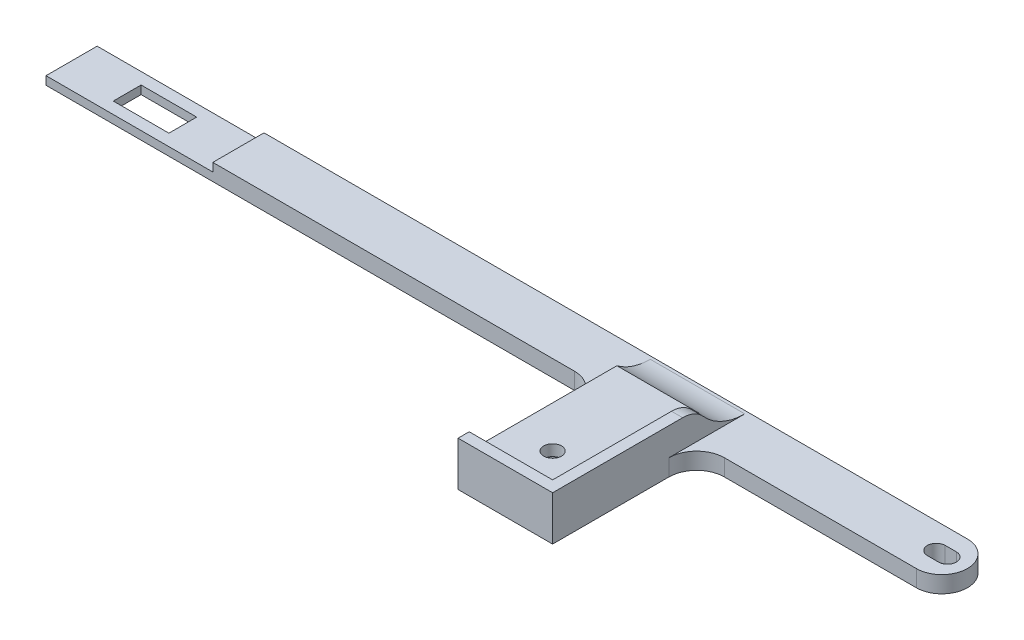
ISO-10303-21;
HEADER;
FILE_DESCRIPTION(('STEP AP214'),'2;1');
FILE_NAME('part.step','',(''),(''),'','','');
FILE_SCHEMA(('AUTOMOTIVE_DESIGN { 1 0 10303 214 1 1 1 1 }'));
ENDSEC;
DATA;
#1=APPLICATION_CONTEXT('core data for automotive mechanical design processes');
#2=APPLICATION_PROTOCOL_DEFINITION('international standard','automotive_design',2000,#1);
#3=PRODUCT_CONTEXT('',#1,'mechanical');
#4=PRODUCT('Part','Part','',(#3));
#5=PRODUCT_RELATED_PRODUCT_CATEGORY('part','',(#4));
#6=PRODUCT_DEFINITION_FORMATION('','',#4);
#7=PRODUCT_DEFINITION_CONTEXT('part definition',#1,'design');
#8=PRODUCT_DEFINITION('design','',#6,#7);
#9=PRODUCT_DEFINITION_SHAPE('','',#8);
#10=(LENGTH_UNIT() NAMED_UNIT(*) SI_UNIT(.MILLI.,.METRE.));
#11=(NAMED_UNIT(*) PLANE_ANGLE_UNIT() SI_UNIT($,.RADIAN.));
#12=(NAMED_UNIT(*) SI_UNIT($,.STERADIAN.) SOLID_ANGLE_UNIT());
#13=UNCERTAINTY_MEASURE_WITH_UNIT(LENGTH_MEASURE(1.E-05),#10,'distance_accuracy_value','');
#14=(GEOMETRIC_REPRESENTATION_CONTEXT(3) GLOBAL_UNCERTAINTY_ASSIGNED_CONTEXT((#13)) GLOBAL_UNIT_ASSIGNED_CONTEXT((#10,
#11,#12)) REPRESENTATION_CONTEXT('',''));
#15=CARTESIAN_POINT('',(0.,0.,0.));
#16=DIRECTION('',(0.,0.,1.));
#17=DIRECTION('',(1.,0.,0.));
#18=AXIS2_PLACEMENT_3D('',#15,#16,#17);
#19=CARTESIAN_POINT('',(0.,0.,0.));
#20=DIRECTION('',(1.,0.,0.));
#21=DIRECTION('',(0.,0.,-1.));
#22=AXIS2_PLACEMENT_3D('',#19,#20,#21);
#23=PLANE('',#22);
#24=DIRECTION('',(0.,0.,1.));
#25=VECTOR('',#24,1.);
#26=CARTESIAN_POINT('',(0.,1.5,-4.60000000000002));
#27=LINE('',#26,#25);
#28=CARTESIAN_POINT('',(0.,1.5,-4.60000000000002));
#29=VERTEX_POINT('',#28);
#30=CARTESIAN_POINT('',(0.,1.5,4.60000000000002));
#31=VERTEX_POINT('',#30);
#32=EDGE_CURVE('E277',#29,#31,#27,.T.);
#33=ORIENTED_EDGE('',*,*,#32,.F.);
#34=DIRECTION('',(0.,1.,0.));
#35=VECTOR('',#34,1.);
#36=CARTESIAN_POINT('',(0.,3.,-4.6));
#37=LINE('',#36,#35);
#38=CARTESIAN_POINT('',(0.,0.,-4.6));
#39=VERTEX_POINT('',#38);
#40=EDGE_CURVE('E487',#39,#29,#37,.T.);
#41=ORIENTED_EDGE('',*,*,#40,.F.);
#42=DIRECTION('',(0.,0.,-1.));
#43=VECTOR('',#42,1.);
#44=CARTESIAN_POINT('',(0.,0.,0.));
#45=LINE('',#44,#43);
#46=CARTESIAN_POINT('',(0.,0.,4.6));
#47=VERTEX_POINT('',#46);
#48=EDGE_CURVE('E40',#47,#39,#45,.T.);
#49=ORIENTED_EDGE('',*,*,#48,.F.);
#50=DIRECTION('',(0.,-1.,0.));
#51=VECTOR('',#50,1.);
#52=CARTESIAN_POINT('',(0.,3.,4.6));
#53=LINE('',#52,#51);
#54=EDGE_CURVE('E11',#31,#47,#53,.T.);
#55=ORIENTED_EDGE('',*,*,#54,.F.);
#56=EDGE_LOOP('',(#33,#41,#49,#55));
#57=FACE_BOUND('',#56,.T.);
#58=ADVANCED_FACE('F33',(#57),#23,.F.);
#59=CARTESIAN_POINT('',(107.5,9.52548339959392,21.));
#60=DIRECTION('',(0.,-1.,0.));
#61=DIRECTION('',(0.,0.,-1.));
#62=AXIS2_PLACEMENT_3D('',#59,#60,#61);
#63=CYLINDRICAL_SURFACE('',#62,1.6);
#64=CARTESIAN_POINT('',(107.5,5.,21.));
#65=DIRECTION('',(0.,-1.,0.));
#66=DIRECTION('',(0.,0.,-1.));
#67=AXIS2_PLACEMENT_3D('',#64,#65,#66);
#68=CIRCLE('',#67,1.6);
#69=CARTESIAN_POINT('',(107.5,5.,19.4));
#70=VERTEX_POINT('',#69);
#71=EDGE_CURVE('E295',#70,#70,#68,.F.);
#72=ORIENTED_EDGE('',*,*,#71,.T.);
#73=EDGE_LOOP('',(#72));
#74=FACE_BOUND('',#73,.T.);
#75=CARTESIAN_POINT('',(107.5,3.,21.));
#76=DIRECTION('',(0.,-1.,0.));
#77=DIRECTION('',(0.,0.,1.));
#78=AXIS2_PLACEMENT_3D('',#75,#76,#77);
#79=CIRCLE('',#78,1.6);
#80=CARTESIAN_POINT('',(107.5,3.,22.6));
#81=VERTEX_POINT('',#80);
#82=EDGE_CURVE('E291',#81,#81,#79,.T.);
#83=ORIENTED_EDGE('',*,*,#82,.T.);
#84=EDGE_LOOP('',(#83));
#85=FACE_BOUND('',#84,.T.);
#86=ADVANCED_FACE('F558',(#74,#85),#63,.F.);
#87=CARTESIAN_POINT('',(115.,8.,4.6));
#88=DIRECTION('',(1.,0.,0.));
#89=DIRECTION('',(0.,0.,-1.));
#90=AXIS2_PLACEMENT_3D('',#87,#88,#89);
#91=PLANE('',#90);
#92=DIRECTION('',(0.,0.,1.));
#93=VECTOR('',#92,1.);
#94=CARTESIAN_POINT('',(115.,8.,4.6));
#95=LINE('',#94,#93);
#96=CARTESIAN_POINT('',(115.,8.,7.12008584965456));
#97=VERTEX_POINT('',#96);
#98=CARTESIAN_POINT('',(115.,8.,28.5));
#99=VERTEX_POINT('',#98);
#100=EDGE_CURVE('E354',#97,#99,#95,.T.);
#101=ORIENTED_EDGE('',*,*,#100,.F.);
#102=CARTESIAN_POINT('',(115.,3.,7.12008584965456));
#103=DIRECTION('',(1.,0.,0.));
#104=DIRECTION('',(0.,0.,-1.));
#105=AXIS2_PLACEMENT_3D('',#102,#103,#104);
#106=CIRCLE('',#105,5.);
#107=CARTESIAN_POINT('',(115.,6.33333333333333,3.39330588715491));
#108=VERTEX_POINT('',#107);
#109=EDGE_CURVE('E481',#97,#108,#106,.F.);
#110=ORIENTED_EDGE('',*,*,#109,.T.);
#111=CARTESIAN_POINT('',(115.,13.,-4.06025403784438));
#112=DIRECTION('',(1.,0.,0.));
#113=DIRECTION('',(0.,0.,-1.));
#114=AXIS2_PLACEMENT_3D('',#111,#112,#113);
#115=CIRCLE('',#114,10.);
#116=CARTESIAN_POINT('',(115.,5.,1.93974596215562));
#117=VERTEX_POINT('',#116);
#118=EDGE_CURVE('E450',#108,#117,#115,.T.);
#119=ORIENTED_EDGE('',*,*,#118,.T.);
#120=DIRECTION('',(0.,0.,1.));
#121=VECTOR('',#120,1.);
#122=CARTESIAN_POINT('',(115.,5.,4.6));
#123=LINE('',#122,#121);
#124=CARTESIAN_POINT('',(115.,5.,28.5));
#125=VERTEX_POINT('',#124);
#126=EDGE_CURVE('E336',#117,#125,#123,.T.);
#127=ORIENTED_EDGE('',*,*,#126,.T.);
#128=DIRECTION('',(0.,-1.,0.));
#129=VECTOR('',#128,1.);
#130=CARTESIAN_POINT('',(115.,8.,28.5));
#131=LINE('',#130,#129);
#132=EDGE_CURVE('E368',#99,#125,#131,.T.);
#133=ORIENTED_EDGE('',*,*,#132,.F.);
#134=EDGE_LOOP('',(#101,#110,#119,#127,#133));
#135=FACE_BOUND('',#134,.T.);
#136=ADVANCED_FACE('F562',(#135),#91,.F.);
#137=CARTESIAN_POINT('',(0.,5.,0.));
#138=DIRECTION('',(0.,1.,0.));
#139=DIRECTION('',(0.,0.,1.));
#140=AXIS2_PLACEMENT_3D('',#137,#138,#139);
#141=PLANE('',#140);
#142=ORIENTED_EDGE('',*,*,#71,.F.);
#143=EDGE_LOOP('',(#142));
#144=FACE_BOUND('',#143,.T.);
#145=DIRECTION('',(-1.,0.,0.));
#146=VECTOR('',#145,1.);
#147=CARTESIAN_POINT('',(115.,5.,28.5));
#148=LINE('',#147,#146);
#149=CARTESIAN_POINT('',(100.,5.,28.5));
#150=VERTEX_POINT('',#149);
#151=EDGE_CURVE('E351',#125,#150,#148,.T.);
#152=ORIENTED_EDGE('',*,*,#151,.F.);
#153=ORIENTED_EDGE('',*,*,#126,.F.);
#154=DIRECTION('',(1.,0.,0.));
#155=VECTOR('',#154,1.);
#156=CARTESIAN_POINT('',(115.,5.,1.93974596215561));
#157=LINE('',#156,#155);
#158=CARTESIAN_POINT('',(100.,5.,1.93974596215562));
#159=VERTEX_POINT('',#158);
#160=EDGE_CURVE('E452',#117,#159,#157,.F.);
#161=ORIENTED_EDGE('',*,*,#160,.T.);
#162=DIRECTION('',(0.,0.,1.));
#163=VECTOR('',#162,1.);
#164=CARTESIAN_POINT('',(100.,5.,4.6));
#165=LINE('',#164,#163);
#166=EDGE_CURVE('E379',#159,#150,#165,.T.);
#167=ORIENTED_EDGE('',*,*,#166,.T.);
#168=EDGE_LOOP('',(#152,#153,#161,#167));
#169=FACE_BOUND('',#168,.T.);
#170=ADVANCED_FACE('F601',(#144,#169),#141,.T.);
#171=CARTESIAN_POINT('',(115.,8.,28.5));
#172=DIRECTION('',(0.,0.,1.));
#173=DIRECTION('',(1.,0.,0.));
#174=AXIS2_PLACEMENT_3D('',#171,#172,#173);
#175=PLANE('',#174);
#176=ORIENTED_EDGE('',*,*,#151,.T.);
#177=DIRECTION('',(0.,-1.,0.));
#178=VECTOR('',#177,1.);
#179=CARTESIAN_POINT('',(100.,8.,28.5));
#180=LINE('',#179,#178);
#181=CARTESIAN_POINT('',(100.,8.,28.5));
#182=VERTEX_POINT('',#181);
#183=EDGE_CURVE('E361',#182,#150,#180,.T.);
#184=ORIENTED_EDGE('',*,*,#183,.F.);
#185=DIRECTION('',(-1.,0.,0.));
#186=VECTOR('',#185,1.);
#187=CARTESIAN_POINT('',(115.,8.,28.5));
#188=LINE('',#187,#186);
#189=EDGE_CURVE('E356',#99,#182,#188,.T.);
#190=ORIENTED_EDGE('',*,*,#189,.F.);
#191=ORIENTED_EDGE('',*,*,#132,.T.);
#192=EDGE_LOOP('',(#176,#184,#190,#191));
#193=FACE_BOUND('',#192,.T.);
#194=ADVANCED_FACE('F597',(#193),#175,.F.);
#195=CARTESIAN_POINT('',(0.,8.,0.));
#196=DIRECTION('',(0.,-1.,0.));
#197=DIRECTION('',(0.,0.,-1.));
#198=AXIS2_PLACEMENT_3D('',#195,#196,#197);
#199=PLANE('',#198);
#200=DIRECTION('',(0.,0.,-1.));
#201=VECTOR('',#200,1.);
#202=CARTESIAN_POINT('',(117.,8.,4.6));
#203=LINE('',#202,#201);
#204=CARTESIAN_POINT('',(117.,8.,30.5));
#205=VERTEX_POINT('',#204);
#206=CARTESIAN_POINT('',(117.,8.,7.12008584965456));
#207=VERTEX_POINT('',#206);
#208=EDGE_CURVE('E350',#205,#207,#203,.T.);
#209=ORIENTED_EDGE('',*,*,#208,.T.);
#210=DIRECTION('',(1.,0.,0.));
#211=VECTOR('',#210,1.);
#212=CARTESIAN_POINT('',(0.,8.,7.12008584965456));
#213=LINE('',#212,#211);
#214=EDGE_CURVE('E478',#207,#97,#213,.F.);
#215=ORIENTED_EDGE('',*,*,#214,.T.);
#216=ORIENTED_EDGE('',*,*,#100,.T.);
#217=ORIENTED_EDGE('',*,*,#189,.T.);
#218=DIRECTION('',(0.,0.,1.));
#219=VECTOR('',#218,1.);
#220=CARTESIAN_POINT('',(100.,8.,30.5));
#221=LINE('',#220,#219);
#222=CARTESIAN_POINT('',(100.,8.,30.5));
#223=VERTEX_POINT('',#222);
#224=EDGE_CURVE('E358',#182,#223,#221,.T.);
#225=ORIENTED_EDGE('',*,*,#224,.T.);
#226=DIRECTION('',(1.,0.,0.));
#227=VECTOR('',#226,1.);
#228=CARTESIAN_POINT('',(117.,8.,30.5));
#229=LINE('',#228,#227);
#230=EDGE_CURVE('E347',#223,#205,#229,.T.);
#231=ORIENTED_EDGE('',*,*,#230,.T.);
#232=EDGE_LOOP('',(#209,#215,#216,#217,#225,#231));
#233=FACE_BOUND('',#232,.T.);
#234=ADVANCED_FACE('F593',(#233),#199,.F.);
#235=CARTESIAN_POINT('',(117.,3.,7.12008584965456));
#236=DIRECTION('',(1.,0.,0.));
#237=DIRECTION('',(0.,0.,-1.));
#238=AXIS2_PLACEMENT_3D('',#235,#236,#237);
#239=CYLINDRICAL_SURFACE('',#238,5.);
#240=CARTESIAN_POINT('',(117.,3.,7.12008584965456));
#241=DIRECTION('',(-1.,0.,0.));
#242=DIRECTION('',(0.,0.,1.));
#243=AXIS2_PLACEMENT_3D('',#240,#241,#242);
#244=CIRCLE('',#243,5.);
#245=CARTESIAN_POINT('',(117.,6.33333333333333,3.39330588715491));
#246=VERTEX_POINT('',#245);
#247=EDGE_CURVE('E485',#246,#207,#244,.F.);
#248=ORIENTED_EDGE('',*,*,#247,.F.);
#249=DIRECTION('',(1.,0.,0.));
#250=VECTOR('',#249,1.);
#251=CARTESIAN_POINT('',(117.,6.33333333333333,3.39330588715491));
#252=LINE('',#251,#250);
#253=EDGE_CURVE('E483',#108,#246,#252,.T.);
#254=ORIENTED_EDGE('',*,*,#253,.F.);
#255=ORIENTED_EDGE('',*,*,#109,.F.);
#256=ORIENTED_EDGE('',*,*,#214,.F.);
#257=EDGE_LOOP('',(#248,#254,#255,#256));
#258=FACE_BOUND('',#257,.T.);
#259=ADVANCED_FACE('F596',(#258),#239,.T.);
#260=CARTESIAN_POINT('',(0.,3.,0.));
#261=DIRECTION('',(0.,1.,0.));
#262=DIRECTION('',(0.,0.,1.));
#263=AXIS2_PLACEMENT_3D('',#260,#261,#262);
#264=PLANE('',#263);
#265=ORIENTED_EDGE('',*,*,#82,.F.);
#266=EDGE_LOOP('',(#265));
#267=FACE_BOUND('',#266,.T.);
#268=DIRECTION('',(0.866025403784439,0.,0.5));
#269=VECTOR('',#268,1.);
#270=CARTESIAN_POINT('',(110.3,3.,19.383419246269));
#271=LINE('',#270,#269);
#272=CARTESIAN_POINT('',(107.5,3.,17.7668384925381));
#273=VERTEX_POINT('',#272);
#274=CARTESIAN_POINT('',(110.3,3.,19.383419246269));
#275=VERTEX_POINT('',#274);
#276=EDGE_CURVE('E299',#273,#275,#271,.T.);
#277=ORIENTED_EDGE('',*,*,#276,.T.);
#278=DIRECTION('',(0.,0.,1.));
#279=VECTOR('',#278,1.);
#280=CARTESIAN_POINT('',(110.3,3.,22.616580753731));
#281=LINE('',#280,#279);
#282=CARTESIAN_POINT('',(110.3,3.,22.616580753731));
#283=VERTEX_POINT('',#282);
#284=EDGE_CURVE('E302',#275,#283,#281,.T.);
#285=ORIENTED_EDGE('',*,*,#284,.T.);
#286=DIRECTION('',(-0.866025403784438,0.,0.500000000000001));
#287=VECTOR('',#286,1.);
#288=CARTESIAN_POINT('',(107.5,3.,24.2331615074619));
#289=LINE('',#288,#287);
#290=CARTESIAN_POINT('',(107.5,3.,24.2331615074619));
#291=VERTEX_POINT('',#290);
#292=EDGE_CURVE('E306',#283,#291,#289,.T.);
#293=ORIENTED_EDGE('',*,*,#292,.T.);
#294=DIRECTION('',(-0.866025403784439,0.,-0.499999999999999));
#295=VECTOR('',#294,1.);
#296=CARTESIAN_POINT('',(104.7,3.,22.6165807537309));
#297=LINE('',#296,#295);
#298=CARTESIAN_POINT('',(104.7,3.,22.6165807537309));
#299=VERTEX_POINT('',#298);
#300=EDGE_CURVE('E309',#291,#299,#297,.T.);
#301=ORIENTED_EDGE('',*,*,#300,.T.);
#302=DIRECTION('',(0.,0.,-1.));
#303=VECTOR('',#302,1.);
#304=CARTESIAN_POINT('',(104.7,3.,19.383419246269));
#305=LINE('',#304,#303);
#306=CARTESIAN_POINT('',(104.7,3.,19.383419246269));
#307=VERTEX_POINT('',#306);
#308=EDGE_CURVE('E312',#299,#307,#305,.T.);
#309=ORIENTED_EDGE('',*,*,#308,.T.);
#310=DIRECTION('',(0.866025403784438,0.,-0.500000000000001));
#311=VECTOR('',#310,1.);
#312=CARTESIAN_POINT('',(107.5,3.,17.7668384925381));
#313=LINE('',#312,#311);
#314=EDGE_CURVE('E315',#307,#273,#313,.T.);
#315=ORIENTED_EDGE('',*,*,#314,.T.);
#316=EDGE_LOOP('',(#277,#285,#293,#301,#309,#315));
#317=FACE_BOUND('',#316,.T.);
#318=ADVANCED_FACE('F648',(#267,#317),#264,.F.);
#319=CARTESIAN_POINT('',(117.,13.,-4.06025403784438));
#320=DIRECTION('',(1.,0.,0.));
#321=DIRECTION('',(0.,0.,-1.));
#322=AXIS2_PLACEMENT_3D('',#319,#320,#321);
#323=CYLINDRICAL_SURFACE('',#322,10.);
#324=ORIENTED_EDGE('',*,*,#118,.F.);
#325=ORIENTED_EDGE('',*,*,#253,.T.);
#326=CARTESIAN_POINT('',(117.,13.,-4.06025403784438));
#327=DIRECTION('',(-1.,0.,0.));
#328=DIRECTION('',(0.,0.,1.));
#329=AXIS2_PLACEMENT_3D('',#326,#327,#328);
#330=CIRCLE('',#329,10.);
#331=CARTESIAN_POINT('',(117.,3.,-4.06025403784438));
#332=VERTEX_POINT('',#331);
#333=EDGE_CURVE('E447',#332,#246,#330,.T.);
#334=ORIENTED_EDGE('',*,*,#333,.F.);
#335=DIRECTION('',(-1.,0.,0.));
#336=VECTOR('',#335,1.);
#337=CARTESIAN_POINT('',(117.,3.,-4.06025403784438));
#338=LINE('',#337,#336);
#339=CARTESIAN_POINT('',(100.,3.,-4.06025403784438));
#340=VERTEX_POINT('',#339);
#341=EDGE_CURVE('E442',#340,#332,#338,.F.);
#342=ORIENTED_EDGE('',*,*,#341,.F.);
#343=CARTESIAN_POINT('',(100.,13.,-4.06025403784438));
#344=DIRECTION('',(1.,0.,0.));
#345=DIRECTION('',(0.,0.,-1.));
#346=AXIS2_PLACEMENT_3D('',#343,#344,#345);
#347=CIRCLE('',#346,10.);
#348=EDGE_CURVE('E455',#159,#340,#347,.T.);
#349=ORIENTED_EDGE('',*,*,#348,.F.);
#350=ORIENTED_EDGE('',*,*,#160,.F.);
#351=EDGE_LOOP('',(#324,#325,#334,#342,#349,#350));
#352=FACE_BOUND('',#351,.T.);
#353=ADVANCED_FACE('F620',(#352),#323,.F.);
#354=CARTESIAN_POINT('',(155.5,3.,-1.60000000000004));
#355=DIRECTION('',(0.,0.,1.));
#356=DIRECTION('',(1.,0.,0.));
#357=AXIS2_PLACEMENT_3D('',#354,#355,#356);
#358=PLANE('',#357);
#359=DIRECTION('',(-1.,0.,0.));
#360=VECTOR('',#359,1.);
#361=CARTESIAN_POINT('',(155.5,0.,-1.60000000000004));
#362=LINE('',#361,#360);
#363=CARTESIAN_POINT('',(157.5,0.,-1.60000000000004));
#364=VERTEX_POINT('',#363);
#365=CARTESIAN_POINT('',(155.5,0.,-1.60000000000004));
#366=VERTEX_POINT('',#365);
#367=EDGE_CURVE('E390',#364,#366,#362,.T.);
#368=ORIENTED_EDGE('',*,*,#367,.F.);
#369=DIRECTION('',(0.,-1.,0.));
#370=VECTOR('',#369,1.);
#371=CARTESIAN_POINT('',(157.5,3.,-1.60000000000004));
#372=LINE('',#371,#370);
#373=CARTESIAN_POINT('',(157.5,3.,-1.60000000000004));
#374=VERTEX_POINT('',#373);
#375=EDGE_CURVE('E410',#374,#364,#372,.T.);
#376=ORIENTED_EDGE('',*,*,#375,.F.);
#377=DIRECTION('',(-1.,0.,0.));
#378=VECTOR('',#377,1.);
#379=CARTESIAN_POINT('',(155.5,3.,-1.60000000000004));
#380=LINE('',#379,#378);
#381=CARTESIAN_POINT('',(155.5,3.,-1.60000000000004));
#382=VERTEX_POINT('',#381);
#383=EDGE_CURVE('E395',#374,#382,#380,.T.);
#384=ORIENTED_EDGE('',*,*,#383,.T.);
#385=DIRECTION('',(0.,-1.,0.));
#386=VECTOR('',#385,1.);
#387=CARTESIAN_POINT('',(155.5,3.,-1.60000000000004));
#388=LINE('',#387,#386);
#389=EDGE_CURVE('E397',#382,#366,#388,.T.);
#390=ORIENTED_EDGE('',*,*,#389,.T.);
#391=EDGE_LOOP('',(#368,#376,#384,#390));
#392=FACE_BOUND('',#391,.T.);
#393=ADVANCED_FACE('F616',(#392),#358,.T.);
#394=CARTESIAN_POINT('',(157.5,3.,0.));
#395=DIRECTION('',(0.,-1.,0.));
#396=DIRECTION('',(0.,0.,-1.));
#397=AXIS2_PLACEMENT_3D('',#394,#395,#396);
#398=CYLINDRICAL_SURFACE('',#397,1.6);
#399=CARTESIAN_POINT('',(157.5,0.,0.));
#400=DIRECTION('',(0.,1.,0.));
#401=DIRECTION('',(0.,0.,-1.));
#402=AXIS2_PLACEMENT_3D('',#399,#400,#401);
#403=CIRCLE('',#402,1.6);
#404=CARTESIAN_POINT('',(157.5,0.,1.59999999999996));
#405=VERTEX_POINT('',#404);
#406=EDGE_CURVE('E403',#405,#364,#403,.T.);
#407=ORIENTED_EDGE('',*,*,#406,.F.);
#408=DIRECTION('',(0.,-1.,0.));
#409=VECTOR('',#408,1.);
#410=CARTESIAN_POINT('',(157.5,3.,1.59999999999996));
#411=LINE('',#410,#409);
#412=CARTESIAN_POINT('',(157.5,3.,1.59999999999996));
#413=VERTEX_POINT('',#412);
#414=EDGE_CURVE('E412',#413,#405,#411,.T.);
#415=ORIENTED_EDGE('',*,*,#414,.F.);
#416=CARTESIAN_POINT('',(157.5,3.,0.));
#417=DIRECTION('',(0.,1.,0.));
#418=DIRECTION('',(0.,0.,-1.));
#419=AXIS2_PLACEMENT_3D('',#416,#417,#418);
#420=CIRCLE('',#419,1.6);
#421=EDGE_CURVE('E392',#413,#374,#420,.T.);
#422=ORIENTED_EDGE('',*,*,#421,.T.);
#423=ORIENTED_EDGE('',*,*,#375,.T.);
#424=EDGE_LOOP('',(#407,#415,#422,#423));
#425=FACE_BOUND('',#424,.T.);
#426=ADVANCED_FACE('F619',(#425),#398,.F.);
#427=CARTESIAN_POINT('',(155.5,3.,1.59999999999996));
#428=DIRECTION('',(0.,0.,-1.));
#429=DIRECTION('',(-1.,0.,0.));
#430=AXIS2_PLACEMENT_3D('',#427,#428,#429);
#431=PLANE('',#430);
#432=DIRECTION('',(1.,0.,0.));
#433=VECTOR('',#432,1.);
#434=CARTESIAN_POINT('',(155.5,0.,1.59999999999996));
#435=LINE('',#434,#433);
#436=CARTESIAN_POINT('',(155.5,0.,1.59999999999996));
#437=VERTEX_POINT('',#436);
#438=EDGE_CURVE('E400',#437,#405,#435,.T.);
#439=ORIENTED_EDGE('',*,*,#438,.F.);
#440=DIRECTION('',(0.,-1.,0.));
#441=VECTOR('',#440,1.);
#442=CARTESIAN_POINT('',(155.5,3.,1.59999999999996));
#443=LINE('',#442,#441);
#444=CARTESIAN_POINT('',(155.5,3.,1.59999999999996));
#445=VERTEX_POINT('',#444);
#446=EDGE_CURVE('E414',#445,#437,#443,.T.);
#447=ORIENTED_EDGE('',*,*,#446,.F.);
#448=DIRECTION('',(1.,0.,0.));
#449=VECTOR('',#448,1.);
#450=CARTESIAN_POINT('',(155.5,3.,1.59999999999996));
#451=LINE('',#450,#449);
#452=EDGE_CURVE('E389',#445,#413,#451,.T.);
#453=ORIENTED_EDGE('',*,*,#452,.T.);
#454=ORIENTED_EDGE('',*,*,#414,.T.);
#455=EDGE_LOOP('',(#439,#447,#453,#454));
#456=FACE_BOUND('',#455,.T.);
#457=ADVANCED_FACE('F624',(#456),#431,.T.);
#458=CARTESIAN_POINT('',(155.5,3.,0.));
#459=DIRECTION('',(0.,-1.,0.));
#460=DIRECTION('',(0.,0.,-1.));
#461=AXIS2_PLACEMENT_3D('',#458,#459,#460);
#462=CYLINDRICAL_SURFACE('',#461,1.6);
#463=CARTESIAN_POINT('',(155.5,0.,0.));
#464=DIRECTION('',(0.,1.,0.));
#465=DIRECTION('',(0.,0.,-1.));
#466=AXIS2_PLACEMENT_3D('',#463,#464,#465);
#467=CIRCLE('',#466,1.6);
#468=EDGE_CURVE('E386',#366,#437,#467,.T.);
#469=ORIENTED_EDGE('',*,*,#468,.F.);
#470=ORIENTED_EDGE('',*,*,#389,.F.);
#471=CARTESIAN_POINT('',(155.5,3.,0.));
#472=DIRECTION('',(0.,1.,0.));
#473=DIRECTION('',(0.,0.,-1.));
#474=AXIS2_PLACEMENT_3D('',#471,#472,#473);
#475=CIRCLE('',#474,1.6);
#476=EDGE_CURVE('E387',#382,#445,#475,.T.);
#477=ORIENTED_EDGE('',*,*,#476,.T.);
#478=ORIENTED_EDGE('',*,*,#446,.T.);
#479=EDGE_LOOP('',(#469,#470,#477,#478));
#480=FACE_BOUND('',#479,.T.);
#481=ADVANCED_FACE('F628',(#480),#462,.F.);
#482=CARTESIAN_POINT('',(95.,5.,9.6));
#483=DIRECTION('',(0.,1.,0.));
#484=DIRECTION('',(0.,0.,1.));
#485=AXIS2_PLACEMENT_3D('',#482,#483,#484);
#486=CYLINDRICAL_SURFACE('',#485,5.);
#487=CARTESIAN_POINT('',(95.,3.,9.6));
#488=DIRECTION('',(0.,1.,0.));
#489=DIRECTION('',(0.,0.,1.));
#490=AXIS2_PLACEMENT_3D('',#487,#488,#489);
#491=CIRCLE('',#490,5.);
#492=CARTESIAN_POINT('',(95.,3.,4.6));
#493=VERTEX_POINT('',#492);
#494=CARTESIAN_POINT('',(99.9999999999999,3.,9.6));
#495=VERTEX_POINT('',#494);
#496=EDGE_CURVE('E475',#493,#495,#491,.F.);
#497=ORIENTED_EDGE('',*,*,#496,.F.);
#498=DIRECTION('',(0.,-1.,0.));
#499=VECTOR('',#498,1.);
#500=CARTESIAN_POINT('',(95.,3.,4.6));
#501=LINE('',#500,#499);
#502=CARTESIAN_POINT('',(95.,0.,4.6));
#503=VERTEX_POINT('',#502);
#504=EDGE_CURVE('E465',#503,#493,#501,.F.);
#505=ORIENTED_EDGE('',*,*,#504,.F.);
#506=CARTESIAN_POINT('',(95.,0.,9.6));
#507=DIRECTION('',(0.,1.,0.));
#508=DIRECTION('',(0.,0.,1.));
#509=AXIS2_PLACEMENT_3D('',#506,#507,#508);
#510=CIRCLE('',#509,5.);
#511=CARTESIAN_POINT('',(100.,0.,9.6));
#512=VERTEX_POINT('',#511);
#513=EDGE_CURVE('E472',#512,#503,#510,.T.);
#514=ORIENTED_EDGE('',*,*,#513,.F.);
#515=DIRECTION('',(0.,-1.,0.));
#516=VECTOR('',#515,1.);
#517=CARTESIAN_POINT('',(100.,0.,9.6));
#518=LINE('',#517,#516);
#519=EDGE_CURVE('E462',#495,#512,#518,.T.);
#520=ORIENTED_EDGE('',*,*,#519,.F.);
#521=EDGE_LOOP('',(#497,#505,#514,#520));
#522=FACE_BOUND('',#521,.T.);
#523=ADVANCED_FACE('F530',(#522),#486,.F.);
#524=CARTESIAN_POINT('',(100.,5.,4.6));
#525=DIRECTION('',(1.,0.,0.));
#526=DIRECTION('',(0.,0.,-1.));
#527=AXIS2_PLACEMENT_3D('',#524,#525,#526);
#528=PLANE('',#527);
#529=DIRECTION('',(0.,0.,-1.));
#530=VECTOR('',#529,1.);
#531=CARTESIAN_POINT('',(99.9999999999999,3.,0.));
#532=LINE('',#531,#530);
#533=EDGE_CURVE('E439',#495,#340,#532,.T.);
#534=ORIENTED_EDGE('',*,*,#533,.F.);
#535=ORIENTED_EDGE('',*,*,#519,.T.);
#536=DIRECTION('',(0.,0.,-1.));
#537=VECTOR('',#536,1.);
#538=CARTESIAN_POINT('',(100.,0.,4.6));
#539=LINE('',#538,#537);
#540=CARTESIAN_POINT('',(100.,0.,30.5));
#541=VERTEX_POINT('',#540);
#542=EDGE_CURVE('E371',#541,#512,#539,.T.);
#543=ORIENTED_EDGE('',*,*,#542,.F.);
#544=DIRECTION('',(0.,-1.,0.));
#545=VECTOR('',#544,1.);
#546=CARTESIAN_POINT('',(100.,5.,30.5));
#547=LINE('',#546,#545);
#548=EDGE_CURVE('E384',#223,#541,#547,.T.);
#549=ORIENTED_EDGE('',*,*,#548,.F.);
#550=ORIENTED_EDGE('',*,*,#224,.F.);
#551=ORIENTED_EDGE('',*,*,#183,.T.);
#552=ORIENTED_EDGE('',*,*,#166,.F.);
#553=ORIENTED_EDGE('',*,*,#348,.T.);
#554=EDGE_LOOP('',(#534,#535,#543,#549,#550,#551,#552,#553));
#555=FACE_BOUND('',#554,.T.);
#556=ADVANCED_FACE('F525',(#555),#528,.F.);
#557=CARTESIAN_POINT('',(117.,5.,30.5));
#558=DIRECTION('',(0.,0.,-1.));
#559=DIRECTION('',(-1.,0.,0.));
#560=AXIS2_PLACEMENT_3D('',#557,#558,#559);
#561=PLANE('',#560);
#562=ORIENTED_EDGE('',*,*,#548,.T.);
#563=DIRECTION('',(-1.,0.,0.));
#564=VECTOR('',#563,1.);
#565=CARTESIAN_POINT('',(117.,0.,30.5));
#566=LINE('',#565,#564);
#567=CARTESIAN_POINT('',(117.,0.,30.5));
#568=VERTEX_POINT('',#567);
#569=EDGE_CURVE('E374',#568,#541,#566,.T.);
#570=ORIENTED_EDGE('',*,*,#569,.F.);
#571=DIRECTION('',(0.,-1.,0.));
#572=VECTOR('',#571,1.);
#573=CARTESIAN_POINT('',(117.,5.,30.5));
#574=LINE('',#573,#572);
#575=EDGE_CURVE('E381',#205,#568,#574,.T.);
#576=ORIENTED_EDGE('',*,*,#575,.F.);
#577=ORIENTED_EDGE('',*,*,#230,.F.);
#578=EDGE_LOOP('',(#562,#570,#576,#577));
#579=FACE_BOUND('',#578,.T.);
#580=ADVANCED_FACE('F611',(#579),#561,.F.);
#581=CARTESIAN_POINT('',(117.,5.,13.5));
#582=DIRECTION('',(-1.,0.,0.));
#583=DIRECTION('',(0.,0.,1.));
#584=AXIS2_PLACEMENT_3D('',#581,#582,#583);
#585=PLANE('',#584);
#586=ORIENTED_EDGE('',*,*,#333,.T.);
#587=ORIENTED_EDGE('',*,*,#247,.T.);
#588=ORIENTED_EDGE('',*,*,#208,.F.);
#589=ORIENTED_EDGE('',*,*,#575,.T.);
#590=DIRECTION('',(0.,0.,1.));
#591=VECTOR('',#590,1.);
#592=CARTESIAN_POINT('',(117.,0.,13.5));
#593=LINE('',#592,#591);
#594=CARTESIAN_POINT('',(117.,0.,9.6));
#595=VERTEX_POINT('',#594);
#596=EDGE_CURVE('E377',#595,#568,#593,.T.);
#597=ORIENTED_EDGE('',*,*,#596,.F.);
#598=DIRECTION('',(0.,1.,0.));
#599=VECTOR('',#598,1.);
#600=CARTESIAN_POINT('',(117.,3.,9.6));
#601=LINE('',#600,#599);
#602=CARTESIAN_POINT('',(117.,3.,9.6));
#603=VERTEX_POINT('',#602);
#604=EDGE_CURVE('E457',#595,#603,#601,.T.);
#605=ORIENTED_EDGE('',*,*,#604,.T.);
#606=DIRECTION('',(0.,0.,1.));
#607=VECTOR('',#606,1.);
#608=CARTESIAN_POINT('',(117.,3.,0.));
#609=LINE('',#608,#607);
#610=EDGE_CURVE('E445',#332,#603,#609,.T.);
#611=ORIENTED_EDGE('',*,*,#610,.F.);
#612=EDGE_LOOP('',(#586,#587,#588,#589,#597,#605,#611));
#613=FACE_BOUND('',#612,.T.);
#614=ADVANCED_FACE('F519',(#613),#585,.F.);
#615=CARTESIAN_POINT('',(122.,5.,9.6));
#616=DIRECTION('',(0.,-1.,0.));
#617=DIRECTION('',(0.,0.,-1.));
#618=AXIS2_PLACEMENT_3D('',#615,#616,#617);
#619=CYLINDRICAL_SURFACE('',#618,5.);
#620=CARTESIAN_POINT('',(122.,0.,9.6));
#621=DIRECTION('',(0.,1.,0.));
#622=DIRECTION('',(0.,0.,1.));
#623=AXIS2_PLACEMENT_3D('',#620,#621,#622);
#624=CIRCLE('',#623,5.);
#625=CARTESIAN_POINT('',(122.,0.,4.6));
#626=VERTEX_POINT('',#625);
#627=EDGE_CURVE('E470',#626,#595,#624,.T.);
#628=ORIENTED_EDGE('',*,*,#627,.F.);
#629=DIRECTION('',(0.,1.,0.));
#630=VECTOR('',#629,1.);
#631=CARTESIAN_POINT('',(122.,0.,4.6));
#632=LINE('',#631,#630);
#633=CARTESIAN_POINT('',(122.,3.,4.6));
#634=VERTEX_POINT('',#633);
#635=EDGE_CURVE('E460',#634,#626,#632,.F.);
#636=ORIENTED_EDGE('',*,*,#635,.F.);
#637=CARTESIAN_POINT('',(122.,3.,9.6));
#638=DIRECTION('',(0.,1.,0.));
#639=DIRECTION('',(0.,0.,1.));
#640=AXIS2_PLACEMENT_3D('',#637,#638,#639);
#641=CIRCLE('',#640,5.);
#642=EDGE_CURVE('E468',#603,#634,#641,.F.);
#643=ORIENTED_EDGE('',*,*,#642,.F.);
#644=ORIENTED_EDGE('',*,*,#604,.F.);
#645=EDGE_LOOP('',(#628,#636,#643,#644));
#646=FACE_BOUND('',#645,.T.);
#647=ADVANCED_FACE('F515',(#646),#619,.F.);
#648=CARTESIAN_POINT('',(156.5,3.,4.6));
#649=DIRECTION('',(0.,0.,-1.));
#650=DIRECTION('',(-1.,0.,0.));
#651=AXIS2_PLACEMENT_3D('',#648,#649,#650);
#652=PLANE('',#651);
#653=DIRECTION('',(1.,0.,0.));
#654=VECTOR('',#653,1.);
#655=CARTESIAN_POINT('',(156.5,3.,4.6));
#656=LINE('',#655,#654);
#657=CARTESIAN_POINT('',(156.5,3.,4.6));
#658=VERTEX_POINT('',#657);
#659=EDGE_CURVE('E421',#634,#658,#656,.T.);
#660=ORIENTED_EDGE('',*,*,#659,.F.);
#661=ORIENTED_EDGE('',*,*,#635,.T.);
#662=DIRECTION('',(1.,0.,0.));
#663=VECTOR('',#662,1.);
#664=CARTESIAN_POINT('',(156.5,0.,4.6));
#665=LINE('',#664,#663);
#666=CARTESIAN_POINT('',(156.5,0.,4.6));
#667=VERTEX_POINT('',#666);
#668=EDGE_CURVE('E417',#626,#667,#665,.T.);
#669=ORIENTED_EDGE('',*,*,#668,.T.);
#670=DIRECTION('',(0.,-1.,0.));
#671=VECTOR('',#670,1.);
#672=CARTESIAN_POINT('',(156.5,3.,4.6));
#673=LINE('',#672,#671);
#674=EDGE_CURVE('E436',#658,#667,#673,.T.);
#675=ORIENTED_EDGE('',*,*,#674,.F.);
#676=EDGE_LOOP('',(#660,#661,#669,#675));
#677=FACE_BOUND('',#676,.T.);
#678=ADVANCED_FACE('F546',(#677),#652,.F.);
#679=CARTESIAN_POINT('',(30.,3.,4.60000000000002));
#680=VERTEX_POINT('',#679);
#681=EDGE_CURVE('E418',#680,#493,#656,.T.);
#682=ORIENTED_EDGE('',*,*,#681,.F.);
#683=DIRECTION('',(0.,1.,0.));
#684=VECTOR('',#683,1.);
#685=CARTESIAN_POINT('',(30.,1.5,4.60000000000002));
#686=LINE('',#685,#684);
#687=CARTESIAN_POINT('',(30.,1.5,4.60000000000002));
#688=VERTEX_POINT('',#687);
#689=EDGE_CURVE('E286',#688,#680,#686,.T.);
#690=ORIENTED_EDGE('',*,*,#689,.F.);
#691=DIRECTION('',(1.,0.,0.));
#692=VECTOR('',#691,1.);
#693=CARTESIAN_POINT('',(0.,1.5,4.60000000000002));
#694=LINE('',#693,#692);
#695=EDGE_CURVE('E279',#31,#688,#694,.T.);
#696=ORIENTED_EDGE('',*,*,#695,.F.);
#697=ORIENTED_EDGE('',*,*,#54,.T.);
#698=EDGE_CURVE('E427',#47,#503,#665,.T.);
#699=ORIENTED_EDGE('',*,*,#698,.T.);
#700=ORIENTED_EDGE('',*,*,#504,.T.);
#701=EDGE_LOOP('',(#682,#690,#696,#697,#699,#700));
#702=FACE_BOUND('',#701,.T.);
#703=ADVANCED_FACE('F534',(#702),#652,.F.);
#704=CARTESIAN_POINT('',(107.5,3.,24.2331615074619));
#705=DIRECTION('',(0.500000000000001,0.,0.866025403784438));
#706=DIRECTION('',(0.866025403784438,0.,-0.500000000000001));
#707=AXIS2_PLACEMENT_3D('',#704,#705,#706);
#708=PLANE('',#707);
#709=DIRECTION('',(-0.866025403784438,0.,0.500000000000001));
#710=VECTOR('',#709,1.);
#711=CARTESIAN_POINT('',(107.5,0.,24.2331615074619));
#712=LINE('',#711,#710);
#713=CARTESIAN_POINT('',(110.3,0.,22.616580753731));
#714=VERTEX_POINT('',#713);
#715=CARTESIAN_POINT('',(107.5,0.,24.2331615074619));
#716=VERTEX_POINT('',#715);
#717=EDGE_CURVE('E323',#714,#716,#712,.T.);
#718=ORIENTED_EDGE('',*,*,#717,.T.);
#719=DIRECTION('',(0.,-1.,0.));
#720=VECTOR('',#719,1.);
#721=CARTESIAN_POINT('',(107.5,3.,24.2331615074619));
#722=LINE('',#721,#720);
#723=EDGE_CURVE('E341',#291,#716,#722,.T.);
#724=ORIENTED_EDGE('',*,*,#723,.F.);
#725=ORIENTED_EDGE('',*,*,#292,.F.);
#726=DIRECTION('',(0.,-1.,0.));
#727=VECTOR('',#726,1.);
#728=CARTESIAN_POINT('',(110.3,3.,22.616580753731));
#729=LINE('',#728,#727);
#730=EDGE_CURVE('E343',#283,#714,#729,.T.);
#731=ORIENTED_EDGE('',*,*,#730,.T.);
#732=EDGE_LOOP('',(#718,#724,#725,#731));
#733=FACE_BOUND('',#732,.T.);
#734=ADVANCED_FACE('F553',(#733),#708,.F.);
#735=CARTESIAN_POINT('',(104.7,3.,22.6165807537309));
#736=DIRECTION('',(-0.499999999999999,0.,0.866025403784439));
#737=DIRECTION('',(0.866025403784439,0.,0.499999999999999));
#738=AXIS2_PLACEMENT_3D('',#735,#736,#737);
#739=PLANE('',#738);
#740=DIRECTION('',(-0.866025403784439,0.,-0.499999999999999));
#741=VECTOR('',#740,1.);
#742=CARTESIAN_POINT('',(104.7,0.,22.6165807537309));
#743=LINE('',#742,#741);
#744=CARTESIAN_POINT('',(104.7,0.,22.6165807537309));
#745=VERTEX_POINT('',#744);
#746=EDGE_CURVE('E326',#716,#745,#743,.T.);
#747=ORIENTED_EDGE('',*,*,#746,.T.);
#748=DIRECTION('',(0.,-1.,0.));
#749=VECTOR('',#748,1.);
#750=CARTESIAN_POINT('',(104.7,3.,22.6165807537309));
#751=LINE('',#750,#749);
#752=EDGE_CURVE('E339',#299,#745,#751,.T.);
#753=ORIENTED_EDGE('',*,*,#752,.F.);
#754=ORIENTED_EDGE('',*,*,#300,.F.);
#755=ORIENTED_EDGE('',*,*,#723,.T.);
#756=EDGE_LOOP('',(#747,#753,#754,#755));
#757=FACE_BOUND('',#756,.T.);
#758=ADVANCED_FACE('F757',(#757),#739,.F.);
#759=CARTESIAN_POINT('',(104.7,3.,19.383419246269));
#760=DIRECTION('',(-1.,0.,0.));
#761=DIRECTION('',(0.,0.,1.));
#762=AXIS2_PLACEMENT_3D('',#759,#760,#761);
#763=PLANE('',#762);
#764=DIRECTION('',(0.,0.,-1.));
#765=VECTOR('',#764,1.);
#766=CARTESIAN_POINT('',(104.7,0.,19.383419246269));
#767=LINE('',#766,#765);
#768=CARTESIAN_POINT('',(104.7,0.,19.383419246269));
#769=VERTEX_POINT('',#768);
#770=EDGE_CURVE('E329',#745,#769,#767,.T.);
#771=ORIENTED_EDGE('',*,*,#770,.T.);
#772=DIRECTION('',(0.,-1.,0.));
#773=VECTOR('',#772,1.);
#774=CARTESIAN_POINT('',(104.7,3.,19.383419246269));
#775=LINE('',#774,#773);
#776=EDGE_CURVE('E337',#307,#769,#775,.T.);
#777=ORIENTED_EDGE('',*,*,#776,.F.);
#778=ORIENTED_EDGE('',*,*,#308,.F.);
#779=ORIENTED_EDGE('',*,*,#752,.T.);
#780=EDGE_LOOP('',(#771,#777,#778,#779));
#781=FACE_BOUND('',#780,.T.);
#782=ADVANCED_FACE('F766',(#781),#763,.F.);
#783=CARTESIAN_POINT('',(107.5,3.,17.7668384925381));
#784=DIRECTION('',(-0.500000000000001,0.,-0.866025403784438));
#785=DIRECTION('',(-0.866025403784438,0.,0.500000000000001));
#786=AXIS2_PLACEMENT_3D('',#783,#784,#785);
#787=PLANE('',#786);
#788=DIRECTION('',(0.866025403784438,0.,-0.500000000000001));
#789=VECTOR('',#788,1.);
#790=CARTESIAN_POINT('',(107.5,0.,17.7668384925381));
#791=LINE('',#790,#789);
#792=CARTESIAN_POINT('',(107.5,0.,17.7668384925381));
#793=VERTEX_POINT('',#792);
#794=EDGE_CURVE('E303',#769,#793,#791,.T.);
#795=ORIENTED_EDGE('',*,*,#794,.T.);
#796=DIRECTION('',(0.,-1.,0.));
#797=VECTOR('',#796,1.);
#798=CARTESIAN_POINT('',(107.5,3.,17.7668384925381));
#799=LINE('',#798,#797);
#800=EDGE_CURVE('E334',#273,#793,#799,.T.);
#801=ORIENTED_EDGE('',*,*,#800,.F.);
#802=ORIENTED_EDGE('',*,*,#314,.F.);
#803=ORIENTED_EDGE('',*,*,#776,.T.);
#804=EDGE_LOOP('',(#795,#801,#802,#803));
#805=FACE_BOUND('',#804,.T.);
#806=ADVANCED_FACE('F587',(#805),#787,.F.);
#807=CARTESIAN_POINT('',(110.3,3.,19.383419246269));
#808=DIRECTION('',(0.5,0.,-0.866025403784439));
#809=DIRECTION('',(-0.866025403784439,0.,-0.5));
#810=AXIS2_PLACEMENT_3D('',#807,#808,#809);
#811=PLANE('',#810);
#812=DIRECTION('',(0.866025403784439,0.,0.5));
#813=VECTOR('',#812,1.);
#814=CARTESIAN_POINT('',(110.3,0.,19.383419246269));
#815=LINE('',#814,#813);
#816=CARTESIAN_POINT('',(110.3,0.,19.383419246269));
#817=VERTEX_POINT('',#816);
#818=EDGE_CURVE('E298',#793,#817,#815,.T.);
#819=ORIENTED_EDGE('',*,*,#818,.T.);
#820=DIRECTION('',(0.,-1.,0.));
#821=VECTOR('',#820,1.);
#822=CARTESIAN_POINT('',(110.3,3.,19.383419246269));
#823=LINE('',#822,#821);
#824=EDGE_CURVE('E318',#275,#817,#823,.T.);
#825=ORIENTED_EDGE('',*,*,#824,.F.);
#826=ORIENTED_EDGE('',*,*,#276,.F.);
#827=ORIENTED_EDGE('',*,*,#800,.T.);
#828=EDGE_LOOP('',(#819,#825,#826,#827));
#829=FACE_BOUND('',#828,.T.);
#830=ADVANCED_FACE('F581',(#829),#811,.F.);
#831=CARTESIAN_POINT('',(110.3,3.,22.616580753731));
#832=DIRECTION('',(1.,0.,0.));
#833=DIRECTION('',(0.,0.,-1.));
#834=AXIS2_PLACEMENT_3D('',#831,#832,#833);
#835=PLANE('',#834);
#836=DIRECTION('',(0.,0.,1.));
#837=VECTOR('',#836,1.);
#838=CARTESIAN_POINT('',(110.3,0.,22.616580753731));
#839=LINE('',#838,#837);
#840=EDGE_CURVE('E320',#817,#714,#839,.T.);
#841=ORIENTED_EDGE('',*,*,#840,.T.);
#842=ORIENTED_EDGE('',*,*,#730,.F.);
#843=ORIENTED_EDGE('',*,*,#284,.F.);
#844=ORIENTED_EDGE('',*,*,#824,.T.);
#845=EDGE_LOOP('',(#841,#842,#843,#844));
#846=FACE_BOUND('',#845,.T.);
#847=ADVANCED_FACE('F576',(#846),#835,.F.);
#848=CARTESIAN_POINT('',(156.5,3.,0.));
#849=DIRECTION('',(0.,-1.,0.));
#850=DIRECTION('',(0.,0.,-1.));
#851=AXIS2_PLACEMENT_3D('',#848,#849,#850);
#852=CYLINDRICAL_SURFACE('',#851,4.6);
#853=CARTESIAN_POINT('',(156.5,0.,0.));
#854=DIRECTION('',(0.,1.,0.));
#855=DIRECTION('',(0.,0.,-1.));
#856=AXIS2_PLACEMENT_3D('',#853,#854,#855);
#857=CIRCLE('',#856,4.6);
#858=CARTESIAN_POINT('',(156.5,0.,-4.6));
#859=VERTEX_POINT('',#858);
#860=EDGE_CURVE('E429',#667,#859,#857,.T.);
#861=ORIENTED_EDGE('',*,*,#860,.T.);
#862=DIRECTION('',(0.,-1.,0.));
#863=VECTOR('',#862,1.);
#864=CARTESIAN_POINT('',(156.5,3.,-4.6));
#865=LINE('',#864,#863);
#866=CARTESIAN_POINT('',(156.5,3.,-4.6));
#867=VERTEX_POINT('',#866);
#868=EDGE_CURVE('E426',#867,#859,#865,.T.);
#869=ORIENTED_EDGE('',*,*,#868,.F.);
#870=CARTESIAN_POINT('',(156.5,3.,0.));
#871=DIRECTION('',(0.,1.,0.));
#872=DIRECTION('',(0.,0.,-1.));
#873=AXIS2_PLACEMENT_3D('',#870,#871,#872);
#874=CIRCLE('',#873,4.6);
#875=EDGE_CURVE('E420',#658,#867,#874,.T.);
#876=ORIENTED_EDGE('',*,*,#875,.F.);
#877=ORIENTED_EDGE('',*,*,#674,.T.);
#878=EDGE_LOOP('',(#861,#869,#876,#877));
#879=FACE_BOUND('',#878,.T.);
#880=ADVANCED_FACE('F506',(#879),#852,.T.);
#881=CARTESIAN_POINT('',(-156.5,3.,0.));
#882=DIRECTION('',(0.,1.,0.));
#883=DIRECTION('',(0.,0.,1.));
#884=AXIS2_PLACEMENT_3D('',#881,#882,#883);
#885=PLANE('',#884);
#886=DIRECTION('',(0.,0.,-1.));
#887=VECTOR('',#886,1.);
#888=CARTESIAN_POINT('',(30.,3.,-4.60000000000002));
#889=LINE('',#888,#887);
#890=CARTESIAN_POINT('',(30.,3.,-4.60000000000002));
#891=VERTEX_POINT('',#890);
#892=EDGE_CURVE('E273',#680,#891,#889,.T.);
#893=ORIENTED_EDGE('',*,*,#892,.F.);
#894=ORIENTED_EDGE('',*,*,#681,.T.);
#895=ORIENTED_EDGE('',*,*,#496,.T.);
#896=ORIENTED_EDGE('',*,*,#533,.T.);
#897=ORIENTED_EDGE('',*,*,#341,.T.);
#898=ORIENTED_EDGE('',*,*,#610,.T.);
#899=ORIENTED_EDGE('',*,*,#642,.T.);
#900=ORIENTED_EDGE('',*,*,#659,.T.);
#901=ORIENTED_EDGE('',*,*,#875,.T.);
#902=DIRECTION('',(-1.,0.,0.));
#903=VECTOR('',#902,1.);
#904=CARTESIAN_POINT('',(-156.5,3.,-4.6));
#905=LINE('',#904,#903);
#906=EDGE_CURVE('E423',#867,#891,#905,.T.);
#907=ORIENTED_EDGE('',*,*,#906,.T.);
#908=EDGE_LOOP('',(#893,#894,#895,#896,#897,#898,#899,#900,#901,#907));
#909=FACE_BOUND('',#908,.T.);
#910=ORIENTED_EDGE('',*,*,#452,.F.);
#911=ORIENTED_EDGE('',*,*,#476,.F.);
#912=ORIENTED_EDGE('',*,*,#383,.F.);
#913=ORIENTED_EDGE('',*,*,#421,.F.);
#914=EDGE_LOOP('',(#910,#911,#912,#913));
#915=FACE_BOUND('',#914,.T.);
#916=ADVANCED_FACE('F543',(#909,#915),#885,.T.);
#917=CARTESIAN_POINT('',(-156.5,0.,0.));
#918=DIRECTION('',(0.,1.,0.));
#919=DIRECTION('',(0.,0.,1.));
#920=AXIS2_PLACEMENT_3D('',#917,#918,#919);
#921=PLANE('',#920);
#922=DIRECTION('',(-1.,0.,0.));
#923=VECTOR('',#922,1.);
#924=CARTESIAN_POINT('',(20.,0.,-2.5));
#925=LINE('',#924,#923);
#926=CARTESIAN_POINT('',(20.,0.,-2.5));
#927=VERTEX_POINT('',#926);
#928=CARTESIAN_POINT('',(10.,0.,-2.5));
#929=VERTEX_POINT('',#928);
#930=EDGE_CURVE('E248',#927,#929,#925,.T.);
#931=ORIENTED_EDGE('',*,*,#930,.T.);
#932=DIRECTION('',(0.,0.,1.));
#933=VECTOR('',#932,1.);
#934=CARTESIAN_POINT('',(10.,0.,-2.5));
#935=LINE('',#934,#933);
#936=CARTESIAN_POINT('',(10.,0.,2.5));
#937=VERTEX_POINT('',#936);
#938=EDGE_CURVE('E242',#929,#937,#935,.T.);
#939=ORIENTED_EDGE('',*,*,#938,.T.);
#940=DIRECTION('',(1.,0.,0.));
#941=VECTOR('',#940,1.);
#942=CARTESIAN_POINT('',(20.,0.,2.5));
#943=LINE('',#942,#941);
#944=CARTESIAN_POINT('',(20.,0.,2.5));
#945=VERTEX_POINT('',#944);
#946=EDGE_CURVE('E251',#937,#945,#943,.T.);
#947=ORIENTED_EDGE('',*,*,#946,.T.);
#948=DIRECTION('',(0.,0.,-1.));
#949=VECTOR('',#948,1.);
#950=CARTESIAN_POINT('',(20.,0.,-2.5));
#951=LINE('',#950,#949);
#952=EDGE_CURVE('E47',#945,#927,#951,.T.);
#953=ORIENTED_EDGE('',*,*,#952,.T.);
#954=EDGE_LOOP('',(#931,#939,#947,#953));
#955=FACE_BOUND('',#954,.T.);
#956=ORIENTED_EDGE('',*,*,#840,.F.);
#957=ORIENTED_EDGE('',*,*,#818,.F.);
#958=ORIENTED_EDGE('',*,*,#794,.F.);
#959=ORIENTED_EDGE('',*,*,#770,.F.);
#960=ORIENTED_EDGE('',*,*,#746,.F.);
#961=ORIENTED_EDGE('',*,*,#717,.F.);
#962=EDGE_LOOP('',(#956,#957,#958,#959,#960,#961));
#963=FACE_BOUND('',#962,.T.);
#964=ORIENTED_EDGE('',*,*,#698,.F.);
#965=ORIENTED_EDGE('',*,*,#48,.T.);
#966=DIRECTION('',(-1.,0.,0.));
#967=VECTOR('',#966,1.);
#968=CARTESIAN_POINT('',(-156.5,0.,-4.6));
#969=LINE('',#968,#967);
#970=EDGE_CURVE('E431',#859,#39,#969,.T.);
#971=ORIENTED_EDGE('',*,*,#970,.F.);
#972=ORIENTED_EDGE('',*,*,#860,.F.);
#973=ORIENTED_EDGE('',*,*,#668,.F.);
#974=ORIENTED_EDGE('',*,*,#627,.T.);
#975=ORIENTED_EDGE('',*,*,#596,.T.);
#976=ORIENTED_EDGE('',*,*,#569,.T.);
#977=ORIENTED_EDGE('',*,*,#542,.T.);
#978=ORIENTED_EDGE('',*,*,#513,.T.);
#979=EDGE_LOOP('',(#964,#965,#971,#972,#973,#974,#975,#976,#977,#978));
#980=FACE_BOUND('',#979,.T.);
#981=ORIENTED_EDGE('',*,*,#468,.T.);
#982=ORIENTED_EDGE('',*,*,#438,.T.);
#983=ORIENTED_EDGE('',*,*,#406,.T.);
#984=ORIENTED_EDGE('',*,*,#367,.T.);
#985=EDGE_LOOP('',(#981,#982,#983,#984));
#986=FACE_BOUND('',#985,.T.);
#987=ADVANCED_FACE('F255',(#955,#963,#980,#986),#921,.F.);
#988=CARTESIAN_POINT('',(-156.5,3.,-4.6));
#989=DIRECTION('',(0.,0.,1.));
#990=DIRECTION('',(1.,0.,0.));
#991=AXIS2_PLACEMENT_3D('',#988,#989,#990);
#992=PLANE('',#991);
#993=DIRECTION('',(-1.,0.,0.));
#994=VECTOR('',#993,1.);
#995=CARTESIAN_POINT('',(0.,1.5,-4.60000000000002));
#996=LINE('',#995,#994);
#997=CARTESIAN_POINT('',(30.,1.5,-4.6));
#998=VERTEX_POINT('',#997);
#999=EDGE_CURVE('E284',#998,#29,#996,.T.);
#1000=ORIENTED_EDGE('',*,*,#999,.F.);
#1001=DIRECTION('',(0.,1.,0.));
#1002=VECTOR('',#1001,1.);
#1003=CARTESIAN_POINT('',(30.,1.5,-4.60000000000002));
#1004=LINE('',#1003,#1002);
#1005=EDGE_CURVE('E288',#998,#891,#1004,.T.);
#1006=ORIENTED_EDGE('',*,*,#1005,.T.);
#1007=ORIENTED_EDGE('',*,*,#906,.F.);
#1008=ORIENTED_EDGE('',*,*,#868,.T.);
#1009=ORIENTED_EDGE('',*,*,#970,.T.);
#1010=ORIENTED_EDGE('',*,*,#40,.T.);
#1011=EDGE_LOOP('',(#1000,#1006,#1007,#1008,#1009,#1010));
#1012=FACE_BOUND('',#1011,.T.);
#1013=ADVANCED_FACE('F501',(#1012),#992,.F.);
#1014=CARTESIAN_POINT('',(30.,1.5,-4.60000000000002));
#1015=DIRECTION('',(1.,0.,0.));
#1016=DIRECTION('',(0.,0.,-1.));
#1017=AXIS2_PLACEMENT_3D('',#1014,#1015,#1016);
#1018=PLANE('',#1017);
#1019=ORIENTED_EDGE('',*,*,#892,.T.);
#1020=ORIENTED_EDGE('',*,*,#1005,.F.);
#1021=DIRECTION('',(0.,0.,-1.));
#1022=VECTOR('',#1021,1.);
#1023=CARTESIAN_POINT('',(30.,1.5,-4.60000000000002));
#1024=LINE('',#1023,#1022);
#1025=EDGE_CURVE('E282',#688,#998,#1024,.T.);
#1026=ORIENTED_EDGE('',*,*,#1025,.F.);
#1027=ORIENTED_EDGE('',*,*,#689,.T.);
#1028=EDGE_LOOP('',(#1019,#1020,#1026,#1027));
#1029=FACE_BOUND('',#1028,.T.);
#1030=ADVANCED_FACE('F565',(#1029),#1018,.F.);
#1031=CARTESIAN_POINT('',(0.,1.5,0.));
#1032=DIRECTION('',(0.,1.,0.));
#1033=DIRECTION('',(0.,0.,1.));
#1034=AXIS2_PLACEMENT_3D('',#1031,#1032,#1033);
#1035=PLANE('',#1034);
#1036=DIRECTION('',(0.,0.,1.));
#1037=VECTOR('',#1036,1.);
#1038=CARTESIAN_POINT('',(10.,1.5,-2.5));
#1039=LINE('',#1038,#1037);
#1040=CARTESIAN_POINT('',(10.,1.5,-2.5));
#1041=VERTEX_POINT('',#1040);
#1042=CARTESIAN_POINT('',(10.,1.5,2.5));
#1043=VERTEX_POINT('',#1042);
#1044=EDGE_CURVE('E55',#1041,#1043,#1039,.T.);
#1045=ORIENTED_EDGE('',*,*,#1044,.F.);
#1046=DIRECTION('',(-1.,0.,0.));
#1047=VECTOR('',#1046,1.);
#1048=CARTESIAN_POINT('',(20.,1.5,-2.5));
#1049=LINE('',#1048,#1047);
#1050=CARTESIAN_POINT('',(20.,1.5,-2.5));
#1051=VERTEX_POINT('',#1050);
#1052=EDGE_CURVE('E258',#1051,#1041,#1049,.T.);
#1053=ORIENTED_EDGE('',*,*,#1052,.F.);
#1054=DIRECTION('',(0.,0.,-1.));
#1055=VECTOR('',#1054,1.);
#1056=CARTESIAN_POINT('',(20.,1.5,-2.5));
#1057=LINE('',#1056,#1055);
#1058=CARTESIAN_POINT('',(20.,1.5,2.5));
#1059=VERTEX_POINT('',#1058);
#1060=EDGE_CURVE('E261',#1059,#1051,#1057,.T.);
#1061=ORIENTED_EDGE('',*,*,#1060,.F.);
#1062=DIRECTION('',(1.,0.,0.));
#1063=VECTOR('',#1062,1.);
#1064=CARTESIAN_POINT('',(20.,1.5,2.5));
#1065=LINE('',#1064,#1063);
#1066=EDGE_CURVE('E267',#1043,#1059,#1065,.T.);
#1067=ORIENTED_EDGE('',*,*,#1066,.F.);
#1068=EDGE_LOOP('',(#1045,#1053,#1061,#1067));
#1069=FACE_BOUND('',#1068,.T.);
#1070=ORIENTED_EDGE('',*,*,#32,.T.);
#1071=ORIENTED_EDGE('',*,*,#695,.T.);
#1072=ORIENTED_EDGE('',*,*,#1025,.T.);
#1073=ORIENTED_EDGE('',*,*,#999,.T.);
#1074=EDGE_LOOP('',(#1070,#1071,#1072,#1073));
#1075=FACE_BOUND('',#1074,.T.);
#1076=ADVANCED_FACE('F538',(#1069,#1075),#1035,.T.);
#1077=CARTESIAN_POINT('',(10.,0.,-2.5));
#1078=DIRECTION('',(-1.,0.,0.));
#1079=DIRECTION('',(0.,0.,1.));
#1080=AXIS2_PLACEMENT_3D('',#1077,#1078,#1079);
#1081=PLANE('',#1080);
#1082=ORIENTED_EDGE('',*,*,#1044,.T.);
#1083=DIRECTION('',(0.,1.,0.));
#1084=VECTOR('',#1083,1.);
#1085=CARTESIAN_POINT('',(10.,0.,2.5));
#1086=LINE('',#1085,#1084);
#1087=EDGE_CURVE('E238',#937,#1043,#1086,.T.);
#1088=ORIENTED_EDGE('',*,*,#1087,.F.);
#1089=ORIENTED_EDGE('',*,*,#938,.F.);
#1090=DIRECTION('',(0.,1.,0.));
#1091=VECTOR('',#1090,1.);
#1092=CARTESIAN_POINT('',(10.,0.,-2.5));
#1093=LINE('',#1092,#1091);
#1094=EDGE_CURVE('E271',#929,#1041,#1093,.T.);
#1095=ORIENTED_EDGE('',*,*,#1094,.T.);
#1096=EDGE_LOOP('',(#1082,#1088,#1089,#1095));
#1097=FACE_BOUND('',#1096,.T.);
#1098=ADVANCED_FACE('F240',(#1097),#1081,.F.);
#1099=CARTESIAN_POINT('',(20.,0.,-2.5));
#1100=DIRECTION('',(0.,0.,-1.));
#1101=DIRECTION('',(-1.,0.,0.));
#1102=AXIS2_PLACEMENT_3D('',#1099,#1100,#1101);
#1103=PLANE('',#1102);
#1104=ORIENTED_EDGE('',*,*,#1052,.T.);
#1105=ORIENTED_EDGE('',*,*,#1094,.F.);
#1106=ORIENTED_EDGE('',*,*,#930,.F.);
#1107=DIRECTION('',(0.,1.,0.));
#1108=VECTOR('',#1107,1.);
#1109=CARTESIAN_POINT('',(20.,0.,-2.5));
#1110=LINE('',#1109,#1108);
#1111=EDGE_CURVE('E274',#927,#1051,#1110,.T.);
#1112=ORIENTED_EDGE('',*,*,#1111,.T.);
#1113=EDGE_LOOP('',(#1104,#1105,#1106,#1112));
#1114=FACE_BOUND('',#1113,.T.);
#1115=ADVANCED_FACE('F847',(#1114),#1103,.F.);
#1116=CARTESIAN_POINT('',(20.,0.,-2.5));
#1117=DIRECTION('',(1.,0.,0.));
#1118=DIRECTION('',(0.,0.,-1.));
#1119=AXIS2_PLACEMENT_3D('',#1116,#1117,#1118);
#1120=PLANE('',#1119);
#1121=ORIENTED_EDGE('',*,*,#1060,.T.);
#1122=ORIENTED_EDGE('',*,*,#1111,.F.);
#1123=ORIENTED_EDGE('',*,*,#952,.F.);
#1124=DIRECTION('',(0.,1.,0.));
#1125=VECTOR('',#1124,1.);
#1126=CARTESIAN_POINT('',(20.,0.,2.5));
#1127=LINE('',#1126,#1125);
#1128=EDGE_CURVE('E247',#945,#1059,#1127,.T.);
#1129=ORIENTED_EDGE('',*,*,#1128,.T.);
#1130=EDGE_LOOP('',(#1121,#1122,#1123,#1129));
#1131=FACE_BOUND('',#1130,.T.);
#1132=ADVANCED_FACE('F855',(#1131),#1120,.F.);
#1133=CARTESIAN_POINT('',(20.,0.,2.5));
#1134=DIRECTION('',(0.,0.,1.));
#1135=DIRECTION('',(1.,0.,0.));
#1136=AXIS2_PLACEMENT_3D('',#1133,#1134,#1135);
#1137=PLANE('',#1136);
#1138=ORIENTED_EDGE('',*,*,#1066,.T.);
#1139=ORIENTED_EDGE('',*,*,#1128,.F.);
#1140=ORIENTED_EDGE('',*,*,#946,.F.);
#1141=ORIENTED_EDGE('',*,*,#1087,.T.);
#1142=EDGE_LOOP('',(#1138,#1139,#1140,#1141));
#1143=FACE_BOUND('',#1142,.T.);
#1144=ADVANCED_FACE('F252',(#1143),#1137,.F.);
#1145=CLOSED_SHELL('',(#58,#86,#136,#170,#194,#234,#259,#318,#353,#393,#426,#457,#481,#523,#556,
#580,#614,#647,#678,#703,#734,#758,#782,#806,#830,#847,#880,#916,#987,#1013,#1030,#1076,#1098,
#1115,#1132,#1144));
#1146=MANIFOLD_SOLID_BREP('B2',#1145);
#1147=ADVANCED_BREP_SHAPE_REPRESENTATION('',(#18,#1146),#14);
#1148=SHAPE_DEFINITION_REPRESENTATION(#9,#1147);
ENDSEC;
END-ISO-10303-21;
